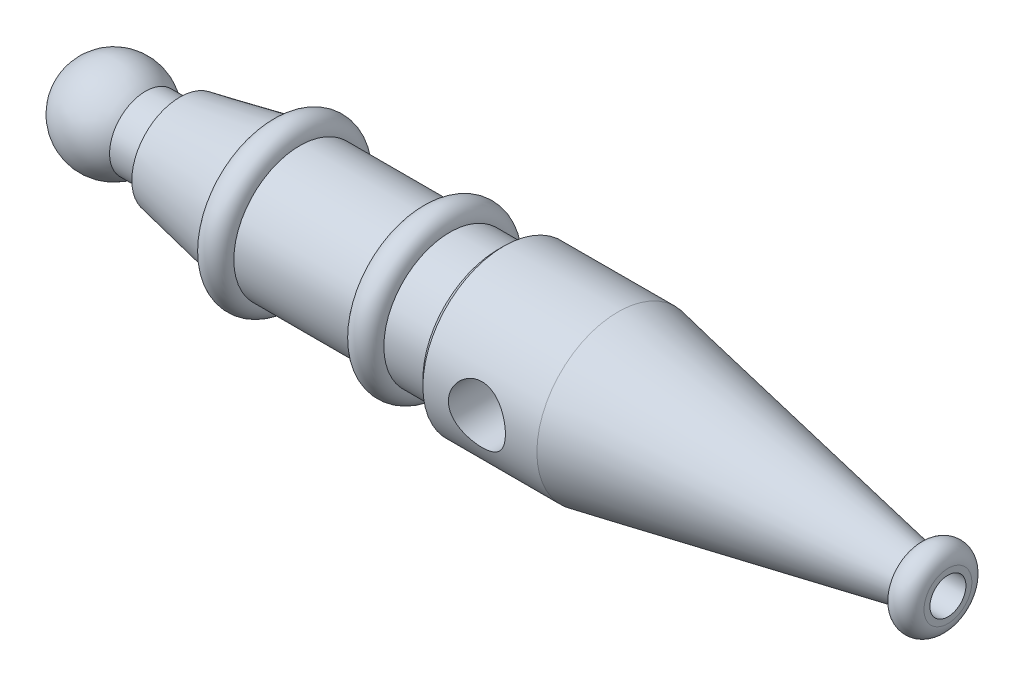
ISO-10303-21;
HEADER;
FILE_DESCRIPTION(('STEP AP214'),'2;1');
FILE_NAME('part.step','',(''),(''),'','','');
FILE_SCHEMA(('AUTOMOTIVE_DESIGN { 1 0 10303 214 1 1 1 1 }'));
ENDSEC;
DATA;
#1=APPLICATION_CONTEXT('core data for automotive mechanical design processes');
#2=APPLICATION_PROTOCOL_DEFINITION('international standard','automotive_design',2000,#1);
#3=PRODUCT_CONTEXT('',#1,'mechanical');
#4=PRODUCT('Part','Part','',(#3));
#5=PRODUCT_RELATED_PRODUCT_CATEGORY('part','',(#4));
#6=PRODUCT_DEFINITION_FORMATION('','',#4);
#7=PRODUCT_DEFINITION_CONTEXT('part definition',#1,'design');
#8=PRODUCT_DEFINITION('design','',#6,#7);
#9=PRODUCT_DEFINITION_SHAPE('','',#8);
#10=(LENGTH_UNIT() NAMED_UNIT(*) SI_UNIT(.MILLI.,.METRE.));
#11=(NAMED_UNIT(*) PLANE_ANGLE_UNIT() SI_UNIT($,.RADIAN.));
#12=(NAMED_UNIT(*) SI_UNIT($,.STERADIAN.) SOLID_ANGLE_UNIT());
#13=UNCERTAINTY_MEASURE_WITH_UNIT(LENGTH_MEASURE(1.E-05),#10,'distance_accuracy_value','');
#14=(GEOMETRIC_REPRESENTATION_CONTEXT(3) GLOBAL_UNCERTAINTY_ASSIGNED_CONTEXT((#13)) GLOBAL_UNIT_ASSIGNED_CONTEXT((#10,
#11,#12)) REPRESENTATION_CONTEXT('',''));
#15=CARTESIAN_POINT('',(0.,0.,0.));
#16=DIRECTION('',(0.,0.,1.));
#17=DIRECTION('',(1.,0.,0.));
#18=AXIS2_PLACEMENT_3D('',#15,#16,#17);
#19=CARTESIAN_POINT('',(-83.855737704918,0.,0.));
#20=DIRECTION('',(-1.,0.,0.));
#21=DIRECTION('',(0.,1.,0.));
#22=AXIS2_PLACEMENT_3D('',#19,#20,#21);
#23=SPHERICAL_SURFACE('',#22,8.);
#24=CARTESIAN_POINT('',(-78.5642350827889,0.,0.));
#25=DIRECTION('',(-1.,0.,0.));
#26=DIRECTION('',(0.,0.,1.));
#27=AXIS2_PLACEMENT_3D('',#24,#25,#26);
#28=CIRCLE('',#27,6.);
#29=CARTESIAN_POINT('',(-78.5642350827889,0.,6.));
#30=VERTEX_POINT('',#29);
#31=EDGE_CURVE('E174',#30,#30,#28,.T.);
#32=ORIENTED_EDGE('',*,*,#31,.T.);
#33=EDGE_LOOP('',(#32));
#34=FACE_BOUND('',#33,.T.);
#35=ADVANCED_FACE('F34',(#34),#23,.T.);
#36=CARTESIAN_POINT('',(5.14426229508198,2.99999999999999,0.));
#37=DIRECTION('',(-1.,0.,0.));
#38=DIRECTION('',(0.,0.,1.));
#39=AXIS2_PLACEMENT_3D('',#36,#37,#38);
#40=PLANE('',#39);
#41=CARTESIAN_POINT('',(5.14426229508191,0.,0.));
#42=DIRECTION('',(-1.,0.,0.));
#43=DIRECTION('',(0.,0.,1.));
#44=AXIS2_PLACEMENT_3D('',#41,#42,#43);
#45=CIRCLE('',#44,2.99999999999999);
#46=CARTESIAN_POINT('',(5.14426229508191,0.,2.99999999999999));
#47=VERTEX_POINT('',#46);
#48=EDGE_CURVE('E53',#47,#47,#45,.T.);
#49=ORIENTED_EDGE('',*,*,#48,.F.);
#50=EDGE_LOOP('',(#49));
#51=FACE_BOUND('',#50,.T.);
#52=ADVANCED_FACE('F108',(#51),#40,.F.);
#53=CARTESIAN_POINT('',(-1091.85573770492,0.,0.));
#54=DIRECTION('',(-1.,0.,0.));
#55=DIRECTION('',(0.,0.,1.));
#56=AXIS2_PLACEMENT_3D('',#53,#54,#55);
#57=CYLINDRICAL_SURFACE('',#56,3.);
#58=CARTESIAN_POINT('',(55.144262295082,0.,0.));
#59=DIRECTION('',(-1.,0.,0.));
#60=DIRECTION('',(0.,0.,1.));
#61=AXIS2_PLACEMENT_3D('',#58,#59,#60);
#62=CIRCLE('',#61,3.);
#63=CARTESIAN_POINT('',(55.144262295082,0.,3.));
#64=VERTEX_POINT('',#63);
#65=EDGE_CURVE('E142',#64,#64,#62,.T.);
#66=ORIENTED_EDGE('',*,*,#65,.F.);
#67=EDGE_LOOP('',(#66));
#68=FACE_BOUND('',#67,.T.);
#69=ORIENTED_EDGE('',*,*,#48,.T.);
#70=EDGE_LOOP('',(#69));
#71=FACE_BOUND('',#70,.T.);
#72=ADVANCED_FACE('F113',(#68,#71),#57,.F.);
#73=CARTESIAN_POINT('',(55.144262295082,3.,0.));
#74=DIRECTION('',(-1.,0.,0.));
#75=DIRECTION('',(0.,0.,1.));
#76=AXIS2_PLACEMENT_3D('',#73,#74,#75);
#77=PLANE('',#76);
#78=CARTESIAN_POINT('',(55.144262295082,0.,0.));
#79=DIRECTION('',(-1.,0.,0.));
#80=DIRECTION('',(0.,0.,1.));
#81=AXIS2_PLACEMENT_3D('',#78,#79,#80);
#82=CIRCLE('',#81,3.98520950843493);
#83=CARTESIAN_POINT('',(55.144262295082,0.,3.98520950843493));
#84=VERTEX_POINT('',#83);
#85=EDGE_CURVE('E139',#84,#84,#82,.T.);
#86=ORIENTED_EDGE('',*,*,#85,.F.);
#87=EDGE_LOOP('',(#86));
#88=FACE_BOUND('',#87,.T.);
#89=ORIENTED_EDGE('',*,*,#65,.T.);
#90=EDGE_LOOP('',(#89));
#91=FACE_BOUND('',#90,.T.);
#92=ADVANCED_FACE('F120',(#88,#91),#77,.F.);
#93=CARTESIAN_POINT('',(52.644262295082,0.,0.));
#94=DIRECTION('',(-1.,0.,0.));
#95=DIRECTION('',(0.,0.,1.));
#96=AXIS2_PLACEMENT_3D('',#93,#94,#95);
#97=TOROIDAL_SURFACE('',#96,3.98520950843493,2.5);
#98=CARTESIAN_POINT('',(50.1442622950821,0.,0.));
#99=DIRECTION('',(-1.,0.,0.));
#100=DIRECTION('',(0.,0.,1.));
#101=AXIS2_PLACEMENT_3D('',#98,#99,#100);
#102=CIRCLE('',#101,3.98520950843492);
#103=CARTESIAN_POINT('',(50.1442622950821,0.,3.98520950843492));
#104=VERTEX_POINT('',#103);
#105=EDGE_CURVE('E138',#104,#104,#102,.T.);
#106=ORIENTED_EDGE('',*,*,#105,.F.);
#107=EDGE_LOOP('',(#106));
#108=FACE_BOUND('',#107,.T.);
#109=ORIENTED_EDGE('',*,*,#85,.T.);
#110=EDGE_LOOP('',(#109));
#111=FACE_BOUND('',#110,.T.);
#112=ADVANCED_FACE('F124',(#108,#111),#97,.T.);
#113=CARTESIAN_POINT('',(50.1442622950821,0.,0.));
#114=DIRECTION('',(-1.,0.,0.));
#115=DIRECTION('',(0.,0.,1.));
#116=AXIS2_PLACEMENT_3D('',#113,#114,#115);
#117=CONICAL_SURFACE('',#116,3.98520950843492,0.18804743418636);
#118=CARTESIAN_POINT('',(0.14426229508202,0.,0.));
#119=DIRECTION('',(-1.,0.,0.));
#120=DIRECTION('',(0.,0.,1.));
#121=AXIS2_PLACEMENT_3D('',#118,#119,#120);
#122=CIRCLE('',#121,13.5);
#123=CARTESIAN_POINT('',(0.14426229508202,0.,13.5));
#124=VERTEX_POINT('',#123);
#125=EDGE_CURVE('E135',#124,#124,#122,.T.);
#126=CARTESIAN_POINT('',(0.14426229508202,0.,13.5));
#127=CARTESIAN_POINT('',(0.665095628415354,0.,13.4008875990462));
#128=CARTESIAN_POINT('',(1.18592896174869,0.,13.3017751980924));
#129=CARTESIAN_POINT('',(2.22759562841536,0.,13.1035503961848));
#130=CARTESIAN_POINT('',(2.74842896174869,0.,13.004437995231));
#131=CARTESIAN_POINT('',(3.79009562841536,0.,12.8062131933234));
#132=CARTESIAN_POINT('',(4.31092896174869,0.,12.7071007923696));
#133=CARTESIAN_POINT('',(5.35259562841536,0.,12.508875990462));
#134=CARTESIAN_POINT('',(5.87342896174869,0.,12.4097635895082));
#135=CARTESIAN_POINT('',(6.91509562841536,0.,12.2115387876006));
#136=CARTESIAN_POINT('',(7.43592896174869,0.,12.1124263866468));
#137=CARTESIAN_POINT('',(8.47759562841536,0.,11.9142015847392));
#138=CARTESIAN_POINT('',(8.9984289617487,0.,11.8150891837854));
#139=CARTESIAN_POINT('',(10.0400956284154,0.,11.6168643818777));
#140=CARTESIAN_POINT('',(10.5609289617487,0.,11.5177519809239));
#141=CARTESIAN_POINT('',(11.6025956284154,0.,11.3195271790163));
#142=CARTESIAN_POINT('',(12.1234289617487,0.,11.2204147780625));
#143=CARTESIAN_POINT('',(13.1650956284154,0.,11.0221899761549));
#144=CARTESIAN_POINT('',(13.6859289617487,0.,10.9230775752011));
#145=CARTESIAN_POINT('',(14.7275956284154,0.,10.7248527732935));
#146=CARTESIAN_POINT('',(15.2484289617487,0.,10.6257403723397));
#147=CARTESIAN_POINT('',(16.2900956284154,0.,10.4275155704321));
#148=CARTESIAN_POINT('',(16.8109289617487,0.,10.3284031694783));
#149=CARTESIAN_POINT('',(17.8525956284154,0.,10.1301783675707));
#150=CARTESIAN_POINT('',(18.3734289617487,0.,10.0310659666169));
#151=CARTESIAN_POINT('',(19.4150956284154,0.,9.8328411647093));
#152=CARTESIAN_POINT('',(19.9359289617487,0.,9.73372876375549));
#153=CARTESIAN_POINT('',(20.9775956284154,0.,9.53550396184789));
#154=CARTESIAN_POINT('',(21.4984289617487,0.,9.43639156089408));
#155=CARTESIAN_POINT('',(22.5400956284154,0.,9.23816675898648));
#156=CARTESIAN_POINT('',(23.0609289617487,0.,9.13905435803268));
#157=CARTESIAN_POINT('',(24.1025956284154,0.,8.94082955612507));
#158=CARTESIAN_POINT('',(24.6234289617487,0.,8.84171715517127));
#159=CARTESIAN_POINT('',(25.6650956284154,0.,8.64349235326366));
#160=CARTESIAN_POINT('',(26.1859289617487,0.,8.54437995230986));
#161=CARTESIAN_POINT('',(27.2275956284154,0.,8.34615515040225));
#162=CARTESIAN_POINT('',(27.7484289617487,0.,8.24704274944845));
#163=CARTESIAN_POINT('',(28.7900956284154,0.,8.04881794754084));
#164=CARTESIAN_POINT('',(29.3109289617487,0.,7.94970554658704));
#165=CARTESIAN_POINT('',(30.3525956284154,0.,7.75148074467943));
#166=CARTESIAN_POINT('',(30.8734289617487,0.,7.65236834372563));
#167=CARTESIAN_POINT('',(31.9150956284154,0.,7.45414354181802));
#168=CARTESIAN_POINT('',(32.4359289617487,0.,7.35503114086422));
#169=CARTESIAN_POINT('',(33.4775956284154,0.,7.15680633895662));
#170=CARTESIAN_POINT('',(33.9984289617487,0.,7.05769393800281));
#171=CARTESIAN_POINT('',(35.0400956284154,0.,6.85946913609521));
#172=CARTESIAN_POINT('',(35.5609289617487,0.,6.7603567351414));
#173=CARTESIAN_POINT('',(36.6025956284154,0.,6.5621319332338));
#174=CARTESIAN_POINT('',(37.1234289617487,0.,6.46301953227999));
#175=CARTESIAN_POINT('',(38.1650956284154,0.,6.26479473037239));
#176=CARTESIAN_POINT('',(38.6859289617487,0.,6.16568232941859));
#177=CARTESIAN_POINT('',(39.7275956284154,0.,5.96745752751098));
#178=CARTESIAN_POINT('',(40.2484289617487,0.,5.86834512655718));
#179=CARTESIAN_POINT('',(41.2900956284154,0.,5.67012032464957));
#180=CARTESIAN_POINT('',(41.8109289617487,0.,5.57100792369577));
#181=CARTESIAN_POINT('',(42.8525956284154,0.,5.37278312178816));
#182=CARTESIAN_POINT('',(43.3734289617487,0.,5.27367072083436));
#183=CARTESIAN_POINT('',(44.4150956284154,0.,5.07544591892675));
#184=CARTESIAN_POINT('',(44.9359289617487,0.,4.97633351797295));
#185=CARTESIAN_POINT('',(45.9775956284154,0.,4.77810871606534));
#186=CARTESIAN_POINT('',(46.4984289617487,0.,4.67899631511154));
#187=CARTESIAN_POINT('',(47.5400956284154,0.,4.48077151320394));
#188=CARTESIAN_POINT('',(48.0609289617487,0.,4.38165911225013));
#189=CARTESIAN_POINT('',(49.1025956284154,0.,4.18343431034253));
#190=CARTESIAN_POINT('',(49.6234289617487,0.,4.08432190938872));
#191=CARTESIAN_POINT('',(50.1442622950821,0.,3.98520950843492));
#192=B_SPLINE_CURVE_WITH_KNOTS('',3,(#126,#127,#128,#129,#130,#131,#132,#133,#134,#135,#136,
#137,#138,#139,#140,#141,#142,#143,#144,#145,#146,#147,#148,#149,#150,#151,#152,#153,#154,#155,
#156,#157,#158,#159,#160,#161,#162,#163,#164,#165,#166,#167,#168,#169,#170,#171,#172,#173,#174,
#175,#176,#177,#178,#179,#180,#181,#182,#183,#184,#185,#186,#187,#188,#189,#190,#191),
.UNSPECIFIED.,.F.,.F.,(4,2,2,2,2,2,2,2,2,2,2,2,2,2,2,2,2,2,2,2,2,2,2,2,2,2,2,2,2,2,2,2,4),(0.,
1.5905394249139,3.18107884982781,4.77161827474171,6.36215769965561,7.95269712456952,
9.54323654948342,11.1337759743973,12.7243153993112,14.3148548242251,15.905394249139,
17.4959336740529,19.0864730989668,20.6770125238807,22.2675519487947,23.8580913737086,
25.4486307986225,27.0391702235364,28.6297096484503,30.2202490733642,31.8107884982781,
33.401327923192,34.9918673481059,36.5824067730198,38.1729461979337,39.7634856228476,
41.3540250477615,42.9445644726754,44.5351038975893,46.1256433225032,47.7161827474171,
49.306722172331,50.8972615972449),.UNSPECIFIED.);
#193=EDGE_CURVE('BSEAM104',#124,#104,#192,.T.);
#194=ORIENTED_EDGE('',*,*,#125,.F.);
#195=ORIENTED_EDGE('',*,*,#105,.T.);
#196=ORIENTED_EDGE('',*,*,#193,.T.);
#197=ORIENTED_EDGE('',*,*,#193,.F.);
#198=EDGE_LOOP('',(#194,#196,#195,#197));
#199=FACE_BOUND('',#198,.T.);
#200=ADVANCED_FACE('F104',(#199),#117,.T.);
#201=CARTESIAN_POINT('',(-1091.85573770492,0.,0.));
#202=DIRECTION('',(-1.,0.,0.));
#203=DIRECTION('',(0.,0.,1.));
#204=AXIS2_PLACEMENT_3D('',#201,#202,#203);
#205=CYLINDRICAL_SURFACE('',#204,13.5);
#206=CARTESIAN_POINT('',(-5.10573770491799,0.,13.5));
#207=CARTESIAN_POINT('',(-5.10573744036889,-0.129143118267124,13.5000001881197));
#208=CARTESIAN_POINT('',(-5.11100857769051,-0.258282263427184,13.4981427554375));
#209=CARTESIAN_POINT('',(-5.13204354712407,-0.515643118743995,13.4907631042694));
#210=CARTESIAN_POINT('',(-5.14781098929143,-0.643864497906921,13.4852396249006));
#211=CARTESIAN_POINT('',(-5.18968056866981,-0.898350385882534,13.4706794516002));
#212=CARTESIAN_POINT('',(-5.21577854862057,-1.02461566066553,13.4616441709295));
#213=CARTESIAN_POINT('',(-5.27807480111822,-1.27439359592537,13.4402991871952));
#214=CARTESIAN_POINT('',(-5.31427698568176,-1.39790517021871,13.4279882159781));
#215=CARTESIAN_POINT('',(-5.39637096186523,-1.64102640212671,13.4004462333366));
#216=CARTESIAN_POINT('',(-5.44224118298111,-1.76064407280258,13.3852217291859));
#217=CARTESIAN_POINT('',(-5.54333615813542,-1.99551126369133,13.3522294790378));
#218=CARTESIAN_POINT('',(-5.59856438878123,-2.11075914093149,13.3344607882277));
#219=CARTESIAN_POINT('',(-5.77766180475297,-2.44881866958133,13.2780007756231));
#220=CARTESIAN_POINT('',(-5.91501101057603,-2.66414418304814,13.2361319891791));
#221=CARTESIAN_POINT('',(-6.22702149502384,-3.07637989982878,13.146560140978));
#222=CARTESIAN_POINT('',(-6.40280146348474,-3.27240456353071,13.0987061712714));
#223=CARTESIAN_POINT('',(-6.78436847876588,-3.63291499144245,13.0033351638072));
#224=CARTESIAN_POINT('',(-6.99016316226134,-3.79739270439892,12.9558182150343));
#225=CARTESIAN_POINT('',(-7.43412315633841,-4.09537008056647,12.8648000151555));
#226=CARTESIAN_POINT('',(-7.67312672463632,-4.22768134522449,12.8214808085843));
#227=CARTESIAN_POINT('',(-8.1717637950013,-4.4498483340765,12.7460861209466));
#228=CARTESIAN_POINT('',(-8.4313901367749,-4.53971871926191,12.7140067581216));
#229=CARTESIAN_POINT('',(-8.95382018101994,-4.67106811935983,12.6663283225888));
#230=CARTESIAN_POINT('',(-9.21615198779374,-4.71421253943546,12.6501640862265));
#231=CARTESIAN_POINT('',(-9.74479134751373,-4.756093772565,12.6344814189514));
#232=CARTESIAN_POINT('',(-10.0110974679392,-4.75484621766067,12.6349571285027));
#233=CARTESIAN_POINT('',(-10.5254938014516,-4.70926313153212,12.6520087666769));
#234=CARTESIAN_POINT('',(-10.7738141814143,-4.66715760222383,12.6677514090504));
#235=CARTESIAN_POINT('',(-11.259609899418,-4.54471269507593,12.7121903878487));
#236=CARTESIAN_POINT('',(-11.4970837937993,-4.46436824382044,12.7408884431295));
#237=CARTESIAN_POINT('',(-11.9592849092232,-4.26637020092715,12.8085578761397));
#238=CARTESIAN_POINT('',(-12.1837185695898,-4.14809196731063,12.8476992640918));
#239=CARTESIAN_POINT('',(-12.6102326267118,-3.87801791894732,12.9317801734432));
#240=CARTESIAN_POINT('',(-12.8123059659028,-3.72621156679362,12.9767215158351));
#241=CARTESIAN_POINT('',(-13.2008165217959,-3.38289946693516,13.0705554134897));
#242=CARTESIAN_POINT('',(-13.3856435426399,-3.18958862751562,13.1195251828097));
#243=CARTESIAN_POINT('',(-13.7207019965691,-2.77412630285129,13.2136118163539));
#244=CARTESIAN_POINT('',(-13.8709293096312,-2.55197138786578,13.2587282213297));
#245=CARTESIAN_POINT('',(-14.1340215738417,-2.08141552473883,13.3407404209996));
#246=CARTESIAN_POINT('',(-14.2464101634896,-1.83272836450297,13.3775296224074));
#247=CARTESIAN_POINT('',(-14.4272412136978,-1.31836699811192,13.4379621339847));
#248=CARTESIAN_POINT('',(-14.495700763603,-1.05269944197857,13.4616105557207));
#249=CARTESIAN_POINT('',(-14.5837736261156,-0.525515952005381,13.492227759709));
#250=CARTESIAN_POINT('',(-14.6055593581671,-0.264405565181762,13.4999377467608));
#251=CARTESIAN_POINT('',(-14.605913769804,0.257820224165093,13.5000614504562));
#252=CARTESIAN_POINT('',(-14.5844907030439,0.51893561620478,13.4924780884034));
#253=CARTESIAN_POINT('',(-14.5007274857427,1.02476686229099,13.4633570672028));
#254=CARTESIAN_POINT('',(-14.4397592691548,1.2697395787276,13.4422875914593));
#255=CARTESIAN_POINT('',(-14.2803907886722,1.74585009719055,13.3887805744997));
#256=CARTESIAN_POINT('',(-14.1819856762328,1.97698610270077,13.3563415608295));
#257=CARTESIAN_POINT('',(-13.9475280740239,2.42604461219743,13.2822275039573));
#258=CARTESIAN_POINT('',(-13.8105045094739,2.64342072100384,13.2403206470867));
#259=CARTESIAN_POINT('',(-13.5038203595038,3.052778022945,13.1519759547699));
#260=CARTESIAN_POINT('',(-13.3341488432779,3.24475067435768,13.1055366043805));
#261=CARTESIAN_POINT('',(-12.956795208368,3.60804141394369,13.0103461311236));
#262=CARTESIAN_POINT('',(-12.7476182058356,3.77781134181072,12.9615976232278));
#263=CARTESIAN_POINT('',(-12.3027274001667,4.08008055282651,12.8696535074987));
#264=CARTESIAN_POINT('',(-12.0670125755709,4.2125784006596,12.8264581135458));
#265=CARTESIAN_POINT('',(-11.574933007955,4.43620210291474,12.7508481529211));
#266=CARTESIAN_POINT('',(-11.31856246948,4.52731629823458,12.7184366250972));
#267=CARTESIAN_POINT('',(-10.792687424393,4.66458679700227,12.6687435526386));
#268=CARTESIAN_POINT('',(-10.523189830096,4.71076649853885,12.6514541341614));
#269=CARTESIAN_POINT('',(-9.99525522626536,4.75491034673005,12.6349249369861));
#270=CARTESIAN_POINT('',(-9.73706386708964,4.75547384708907,12.6347120885142));
#271=CARTESIAN_POINT('',(-9.22447489334188,4.71487963226396,12.6499157509016));
#272=CARTESIAN_POINT('',(-8.97007700188881,4.67372497731676,12.6653311153527));
#273=CARTESIAN_POINT('',(-8.4783341822418,4.55278977905758,12.7092906851952));
#274=CARTESIAN_POINT('',(-8.24072840893677,4.47394440926196,12.7375162315793));
#275=CARTESIAN_POINT('',(-7.78194559520495,4.28063977274348,12.8037690885736));
#276=CARTESIAN_POINT('',(-7.56077245923827,4.16617207532328,12.8417987191398));
#277=CARTESIAN_POINT('',(-7.12973062255194,3.89856473505753,12.9256237375628));
#278=CARTESIAN_POINT('',(-6.92090147385217,3.74384337587838,12.9717026524415));
#279=CARTESIAN_POINT('',(-6.53125871699683,3.4025524256821,13.0653675931415));
#280=CARTESIAN_POINT('',(-6.35045348486726,3.21597334764451,13.1129540644552));
#281=CARTESIAN_POINT('',(-6.09993946800656,2.91116692075967,13.1828182162676));
#282=CARTESIAN_POINT('',(-6.01836304318312,2.80276460208756,13.2063451645229));
#283=CARTESIAN_POINT('',(-5.86465107852781,2.57916756755795,13.2518257121555));
#284=CARTESIAN_POINT('',(-5.79251202221653,2.4639754050208,13.2737798961766));
#285=CARTESIAN_POINT('',(-5.65820530197404,2.22749300667711,13.3155059940571));
#286=CARTESIAN_POINT('',(-5.59604103555102,2.1062007115054,13.3352771636489));
#287=CARTESIAN_POINT('',(-5.48225642262551,1.85842265798346,13.3720581872594));
#288=CARTESIAN_POINT('',(-5.43063145151616,1.73193920688356,13.3890692517274));
#289=CARTESIAN_POINT('',(-5.33866976116436,1.47547742008163,13.4197442115705));
#290=CARTESIAN_POINT('',(-5.29826174131208,1.34552719740973,13.4334291766632));
#291=CARTESIAN_POINT('',(-5.22870127923054,1.0823797562171,13.4571875479529));
#292=CARTESIAN_POINT('',(-5.1995441063522,0.949183927478689,13.467262471938));
#293=CARTESIAN_POINT('',(-5.15276762805417,0.680556940884977,13.4835064357787));
#294=CARTESIAN_POINT('',(-5.1351472623988,0.545125989611111,13.4896758345514));
#295=CARTESIAN_POINT('',(-5.11163271777666,0.273128508675537,13.4979224205058));
#296=CARTESIAN_POINT('',(-5.1057379846647,0.136562032984239,13.4999998010733));
#297=CARTESIAN_POINT('',(-5.10573770491799,0.,13.5));
#298=B_SPLINE_CURVE_WITH_KNOTS('',3,(#206,#207,#208,#209,#210,#211,#212,#213,#214,#215,#216,
#217,#218,#219,#220,#221,#222,#223,#224,#225,#226,#227,#228,#229,#230,#231,#232,#233,#234,#235,
#236,#237,#238,#239,#240,#241,#242,#243,#244,#245,#246,#247,#248,#249,#250,#251,#252,#253,#254,
#255,#256,#257,#258,#259,#260,#261,#262,#263,#264,#265,#266,#267,#268,#269,#270,#271,#272,#273,
#274,#275,#276,#277,#278,#279,#280,#281,#282,#283,#284,#285,#286,#287,#288,#289,#290,#291,#292,
#293,#294,#295,#296,#297),.UNSPECIFIED.,.T.,.F.,(4,2,2,2,2,2,2,2,2,2,2,2,2,2,2,2,2,2,2,2,2,2,2,
2,2,2,2,2,2,2,2,2,2,2,2,2,2,2,2,2,2,2,2,2,2,4),(0.,0.38730216989248,0.774737615751539,
1.1620173063921,1.54944714752213,1.93602156887627,2.32273992319906,3.09555293183945,
3.89488660931953,4.69442401803975,5.52009752459107,6.34548559730392,7.14037470506226,
7.93498390599718,8.68852984909684,9.44217579810582,10.2089305578419,10.9759266413905,
11.7878688381559,12.5999076684873,13.421817361481,14.2434071197046,15.0258416189784,
15.8081266734056,16.5646269901033,17.3212253163988,18.0988695181718,18.876774536148,
19.6942648243076,20.5117865890055,21.3295385331554,22.1468644329315,22.9175817299363,
23.6882424950342,24.4407027285909,25.1933411816964,25.9818130314112,26.7705200937117,
27.1831818832618,27.595689469329,28.0083372625073,28.4208035962026,28.8305846978508,
29.2401933103988,29.6497642745192,30.059315882142),.UNSPECIFIED.);
#299=CARTESIAN_POINT('',(-5.10573770491799,0.,13.5));
#300=VERTEX_POINT('',#299);
#301=EDGE_CURVE('E39',#300,#300,#298,.T.);
#302=ORIENTED_EDGE('',*,*,#301,.T.);
#303=EDGE_LOOP('',(#302));
#304=FACE_BOUND('',#303,.T.);
#305=CARTESIAN_POINT('',(-5.105737704918,0.,-13.5));
#306=CARTESIAN_POINT('',(-5.1057374403689,0.129143118267124,-13.5000001881197));
#307=CARTESIAN_POINT('',(-5.11100857769051,0.258282263427184,-13.4981427554375));
#308=CARTESIAN_POINT('',(-5.13204354712407,0.515643118743996,-13.4907631042694));
#309=CARTESIAN_POINT('',(-5.14781098929143,0.643864497906923,-13.4852396249006));
#310=CARTESIAN_POINT('',(-5.18968056866981,0.898350385882535,-13.4706794516002));
#311=CARTESIAN_POINT('',(-5.21577854862057,1.02461566066553,-13.4616441709295));
#312=CARTESIAN_POINT('',(-5.27807480111822,1.27439359592537,-13.4402991871952));
#313=CARTESIAN_POINT('',(-5.31427698568176,1.39790517021871,-13.4279882159781));
#314=CARTESIAN_POINT('',(-5.39637096186523,1.64102640212671,-13.4004462333366));
#315=CARTESIAN_POINT('',(-5.44224118298111,1.76064407280258,-13.3852217291859));
#316=CARTESIAN_POINT('',(-5.54333615813542,1.99551126369133,-13.3522294790378));
#317=CARTESIAN_POINT('',(-5.59856438878123,2.11075914093149,-13.3344607882277));
#318=CARTESIAN_POINT('',(-5.77766180475297,2.44881866958133,-13.2780007756231));
#319=CARTESIAN_POINT('',(-5.91501101057603,2.66414418304814,-13.2361319891791));
#320=CARTESIAN_POINT('',(-6.22702149502385,3.07637989982878,-13.146560140978));
#321=CARTESIAN_POINT('',(-6.40280146348474,3.27240456353071,-13.0987061712714));
#322=CARTESIAN_POINT('',(-6.78436847876588,3.63291499144245,-13.0033351638072));
#323=CARTESIAN_POINT('',(-6.99016316226134,3.79739270439892,-12.9558182150343));
#324=CARTESIAN_POINT('',(-7.43412315633841,4.09537008056647,-12.8648000151555));
#325=CARTESIAN_POINT('',(-7.67312672463632,4.22768134522449,-12.8214808085843));
#326=CARTESIAN_POINT('',(-8.1717637950013,4.4498483340765,-12.7460861209466));
#327=CARTESIAN_POINT('',(-8.4313901367749,4.53971871926191,-12.7140067581216));
#328=CARTESIAN_POINT('',(-8.95382018101994,4.67106811935983,-12.6663283225888));
#329=CARTESIAN_POINT('',(-9.21615198779374,4.71421253943546,-12.6501640862265));
#330=CARTESIAN_POINT('',(-9.74479134751373,4.756093772565,-12.6344814189514));
#331=CARTESIAN_POINT('',(-10.0110974679392,4.75484621766067,-12.6349571285027));
#332=CARTESIAN_POINT('',(-10.5254938014516,4.70926313153212,-12.6520087666769));
#333=CARTESIAN_POINT('',(-10.7738141814143,4.66715760222383,-12.6677514090504));
#334=CARTESIAN_POINT('',(-11.259609899418,4.54471269507593,-12.7121903878487));
#335=CARTESIAN_POINT('',(-11.4970837937993,4.46436824382044,-12.7408884431295));
#336=CARTESIAN_POINT('',(-11.9592849092232,4.26637020092715,-12.8085578761397));
#337=CARTESIAN_POINT('',(-12.1837185695898,4.14809196731063,-12.8476992640918));
#338=CARTESIAN_POINT('',(-12.6102326267118,3.87801791894732,-12.9317801734432));
#339=CARTESIAN_POINT('',(-12.8123059659028,3.72621156679362,-12.9767215158351));
#340=CARTESIAN_POINT('',(-13.2008165217959,3.38289946693516,-13.0705554134897));
#341=CARTESIAN_POINT('',(-13.3856435426399,3.18958862751562,-13.1195251828097));
#342=CARTESIAN_POINT('',(-13.7207019965691,2.77412630285128,-13.2136118163539));
#343=CARTESIAN_POINT('',(-13.8709293096312,2.55197138786578,-13.2587282213297));
#344=CARTESIAN_POINT('',(-14.1340215738417,2.08141552473883,-13.3407404209996));
#345=CARTESIAN_POINT('',(-14.2464101634896,1.83272836450297,-13.3775296224074));
#346=CARTESIAN_POINT('',(-14.4272412136978,1.31836699811192,-13.4379621339847));
#347=CARTESIAN_POINT('',(-14.495700763603,1.05269944197857,-13.4616105557207));
#348=CARTESIAN_POINT('',(-14.5837736261156,0.52551595200538,-13.492227759709));
#349=CARTESIAN_POINT('',(-14.6055593581671,0.26440556518176,-13.4999377467608));
#350=CARTESIAN_POINT('',(-14.605913769804,-0.257820224165094,-13.5000614504562));
#351=CARTESIAN_POINT('',(-14.5844907030439,-0.518935616204781,-13.4924780884034));
#352=CARTESIAN_POINT('',(-14.5007274857427,-1.02476686229099,-13.4633570672028));
#353=CARTESIAN_POINT('',(-14.4397592691548,-1.2697395787276,-13.4422875914593));
#354=CARTESIAN_POINT('',(-14.2803907886722,-1.74585009719055,-13.3887805744997));
#355=CARTESIAN_POINT('',(-14.1819856762328,-1.97698610270077,-13.3563415608295));
#356=CARTESIAN_POINT('',(-13.9475280740239,-2.42604461219744,-13.2822275039573));
#357=CARTESIAN_POINT('',(-13.8105045094739,-2.64342072100384,-13.2403206470867));
#358=CARTESIAN_POINT('',(-13.5038203595037,-3.052778022945,-13.1519759547699));
#359=CARTESIAN_POINT('',(-13.3341488432779,-3.24475067435768,-13.1055366043805));
#360=CARTESIAN_POINT('',(-12.956795208368,-3.60804141394369,-13.0103461311236));
#361=CARTESIAN_POINT('',(-12.7476182058356,-3.77781134181072,-12.9615976232278));
#362=CARTESIAN_POINT('',(-12.3027274001667,-4.08008055282651,-12.8696535074987));
#363=CARTESIAN_POINT('',(-12.0670125755709,-4.2125784006596,-12.8264581135458));
#364=CARTESIAN_POINT('',(-11.574933007955,-4.43620210291474,-12.7508481529211));
#365=CARTESIAN_POINT('',(-11.31856246948,-4.52731629823458,-12.7184366250972));
#366=CARTESIAN_POINT('',(-10.792687424393,-4.66458679700227,-12.6687435526386));
#367=CARTESIAN_POINT('',(-10.523189830096,-4.71076649853885,-12.6514541341614));
#368=CARTESIAN_POINT('',(-9.99525522626536,-4.75491034673005,-12.6349249369861));
#369=CARTESIAN_POINT('',(-9.73706386708964,-4.75547384708907,-12.6347120885142));
#370=CARTESIAN_POINT('',(-9.22447489334188,-4.71487963226396,-12.6499157509016));
#371=CARTESIAN_POINT('',(-8.97007700188881,-4.67372497731676,-12.6653311153527));
#372=CARTESIAN_POINT('',(-8.4783341822418,-4.55278977905758,-12.7092906851952));
#373=CARTESIAN_POINT('',(-8.24072840893677,-4.47394440926196,-12.7375162315793));
#374=CARTESIAN_POINT('',(-7.78194559520495,-4.28063977274348,-12.8037690885736));
#375=CARTESIAN_POINT('',(-7.56077245923827,-4.16617207532328,-12.8417987191398));
#376=CARTESIAN_POINT('',(-7.12973062255194,-3.89856473505752,-12.9256237375628));
#377=CARTESIAN_POINT('',(-6.92090147385217,-3.74384337587837,-12.9717026524415));
#378=CARTESIAN_POINT('',(-6.53125871699682,-3.4025524256821,-13.0653675931415));
#379=CARTESIAN_POINT('',(-6.35045348486725,-3.21597334764451,-13.1129540644552));
#380=CARTESIAN_POINT('',(-6.09993946800656,-2.91116692075967,-13.1828182162676));
#381=CARTESIAN_POINT('',(-6.01836304318312,-2.80276460208756,-13.2063451645229));
#382=CARTESIAN_POINT('',(-5.86465107852781,-2.57916756755794,-13.2518257121555));
#383=CARTESIAN_POINT('',(-5.79251202221653,-2.46397540502079,-13.2737798961766));
#384=CARTESIAN_POINT('',(-5.65820530197404,-2.2274930066771,-13.3155059940571));
#385=CARTESIAN_POINT('',(-5.59604103555102,-2.10620071150539,-13.3352771636489));
#386=CARTESIAN_POINT('',(-5.48225642262551,-1.85842265798346,-13.3720581872594));
#387=CARTESIAN_POINT('',(-5.43063145151616,-1.73193920688356,-13.3890692517274));
#388=CARTESIAN_POINT('',(-5.33866976116436,-1.47547742008162,-13.4197442115705));
#389=CARTESIAN_POINT('',(-5.29826174131207,-1.34552719740973,-13.4334291766632));
#390=CARTESIAN_POINT('',(-5.22870127923054,-1.0823797562171,-13.4571875479529));
#391=CARTESIAN_POINT('',(-5.1995441063522,-0.949183927478687,-13.467262471938));
#392=CARTESIAN_POINT('',(-5.15276762805417,-0.680556940884976,-13.4835064357787));
#393=CARTESIAN_POINT('',(-5.13514726239879,-0.54512598961111,-13.4896758345514));
#394=CARTESIAN_POINT('',(-5.11163271777666,-0.273128508675537,-13.4979224205058));
#395=CARTESIAN_POINT('',(-5.1057379846647,-0.136562032984239,-13.4999998010733));
#396=CARTESIAN_POINT('',(-5.105737704918,0.,-13.5));
#397=B_SPLINE_CURVE_WITH_KNOTS('',3,(#305,#306,#307,#308,#309,#310,#311,#312,#313,#314,#315,
#316,#317,#318,#319,#320,#321,#322,#323,#324,#325,#326,#327,#328,#329,#330,#331,#332,#333,#334,
#335,#336,#337,#338,#339,#340,#341,#342,#343,#344,#345,#346,#347,#348,#349,#350,#351,#352,#353,
#354,#355,#356,#357,#358,#359,#360,#361,#362,#363,#364,#365,#366,#367,#368,#369,#370,#371,#372,
#373,#374,#375,#376,#377,#378,#379,#380,#381,#382,#383,#384,#385,#386,#387,#388,#389,#390,#391,
#392,#393,#394,#395,#396),.UNSPECIFIED.,.T.,.F.,(4,2,2,2,2,2,2,2,2,2,2,2,2,2,2,2,2,2,2,2,2,2,2,
2,2,2,2,2,2,2,2,2,2,2,2,2,2,2,2,2,2,2,2,2,2,4),(0.,0.387302169892482,0.77473761575154,
1.16201730639211,1.54944714752213,1.93602156887627,2.32273992319906,3.09555293183945,
3.89488660931953,4.69442401803975,5.52009752459107,6.34548559730392,7.14037470506226,
7.93498390599718,8.68852984909684,9.44217579810582,10.2089305578419,10.9759266413905,
11.7878688381559,12.5999076684873,13.421817361481,14.2434071197046,15.0258416189784,
15.8081266734056,16.5646269901033,17.3212253163988,18.0988695181718,18.8767745361481,
19.6942648243076,20.5117865890055,21.3295385331554,22.1468644329315,22.9175817299363,
23.6882424950342,24.4407027285909,25.1933411816964,25.9818130314112,26.7705200937117,
27.1831818832618,27.595689469329,28.0083372625073,28.4208035962026,28.8305846978508,
29.2401933103988,29.6497642745192,30.059315882142),.UNSPECIFIED.);
#398=CARTESIAN_POINT('',(-5.105737704918,0.,-13.5));
#399=VERTEX_POINT('',#398);
#400=EDGE_CURVE('E56',#399,#399,#397,.T.);
#401=ORIENTED_EDGE('',*,*,#400,.T.);
#402=EDGE_LOOP('',(#401));
#403=FACE_BOUND('',#402,.T.);
#404=CARTESIAN_POINT('',(-18.8557377049181,0.,0.));
#405=DIRECTION('',(1.,0.,0.));
#406=DIRECTION('',(0.,0.,-1.));
#407=AXIS2_PLACEMENT_3D('',#404,#405,#406);
#408=CIRCLE('',#407,13.5);
#409=CARTESIAN_POINT('',(-18.8557377049181,0.,-13.5));
#410=VERTEX_POINT('',#409);
#411=EDGE_CURVE('E10',#410,#410,#408,.T.);
#412=ORIENTED_EDGE('',*,*,#411,.T.);
#413=EDGE_LOOP('',(#412));
#414=FACE_BOUND('',#413,.T.);
#415=ORIENTED_EDGE('',*,*,#125,.T.);
#416=EDGE_LOOP('',(#415));
#417=FACE_BOUND('',#416,.T.);
#418=ADVANCED_FACE('F61',(#304,#403,#414,#417),#205,.T.);
#419=CARTESIAN_POINT('',(-19.855737704918,11.,0.));
#420=DIRECTION('',(1.,0.,0.));
#421=DIRECTION('',(0.,0.,-1.));
#422=AXIS2_PLACEMENT_3D('',#419,#420,#421);
#423=PLANE('',#422);
#424=CARTESIAN_POINT('',(-19.855737704918,0.,0.));
#425=DIRECTION('',(1.,0.,0.));
#426=DIRECTION('',(0.,0.,-1.));
#427=AXIS2_PLACEMENT_3D('',#424,#425,#426);
#428=CIRCLE('',#427,12.5);
#429=CARTESIAN_POINT('',(-19.855737704918,0.,-12.5));
#430=VERTEX_POINT('',#429);
#431=EDGE_CURVE('E48',#430,#430,#428,.F.);
#432=ORIENTED_EDGE('',*,*,#431,.T.);
#433=EDGE_LOOP('',(#432));
#434=FACE_BOUND('',#433,.T.);
#435=CARTESIAN_POINT('',(-19.855737704918,0.,0.));
#436=DIRECTION('',(-1.,0.,0.));
#437=DIRECTION('',(0.,0.,1.));
#438=AXIS2_PLACEMENT_3D('',#435,#436,#437);
#439=CIRCLE('',#438,11.);
#440=CARTESIAN_POINT('',(-19.855737704918,0.,11.));
#441=VERTEX_POINT('',#440);
#442=EDGE_CURVE('E144',#441,#441,#439,.T.);
#443=ORIENTED_EDGE('',*,*,#442,.F.);
#444=EDGE_LOOP('',(#443));
#445=FACE_BOUND('',#444,.T.);
#446=ADVANCED_FACE('F97',(#434,#445),#423,.F.);
#447=CARTESIAN_POINT('',(-1091.85573770492,0.,0.));
#448=DIRECTION('',(-1.,0.,0.));
#449=DIRECTION('',(0.,0.,1.));
#450=AXIS2_PLACEMENT_3D('',#447,#448,#449);
#451=CYLINDRICAL_SURFACE('',#450,11.);
#452=CARTESIAN_POINT('',(-27.855737704918,0.,0.));
#453=DIRECTION('',(-1.,0.,0.));
#454=DIRECTION('',(0.,0.,1.));
#455=AXIS2_PLACEMENT_3D('',#452,#453,#454);
#456=CIRCLE('',#455,11.);
#457=CARTESIAN_POINT('',(-27.855737704918,0.,11.));
#458=VERTEX_POINT('',#457);
#459=EDGE_CURVE('E156',#458,#458,#456,.T.);
#460=ORIENTED_EDGE('',*,*,#459,.F.);
#461=EDGE_LOOP('',(#460));
#462=FACE_BOUND('',#461,.T.);
#463=ORIENTED_EDGE('',*,*,#442,.T.);
#464=EDGE_LOOP('',(#463));
#465=FACE_BOUND('',#464,.T.);
#466=ADVANCED_FACE('F94',(#462,#465),#451,.T.);
#467=CARTESIAN_POINT('',(-30.355737704918,0.,0.));
#468=DIRECTION('',(-1.,0.,0.));
#469=DIRECTION('',(0.,0.,1.));
#470=AXIS2_PLACEMENT_3D('',#467,#468,#469);
#471=TOROIDAL_SURFACE('',#470,11.,2.5);
#472=CARTESIAN_POINT('',(-32.8557377049181,0.,0.));
#473=DIRECTION('',(-1.,0.,0.));
#474=DIRECTION('',(0.,0.,1.));
#475=AXIS2_PLACEMENT_3D('',#472,#473,#474);
#476=CIRCLE('',#475,11.);
#477=CARTESIAN_POINT('',(-32.8557377049181,0.,11.));
#478=VERTEX_POINT('',#477);
#479=EDGE_CURVE('E159',#478,#478,#476,.T.);
#480=ORIENTED_EDGE('',*,*,#479,.F.);
#481=EDGE_LOOP('',(#480));
#482=FACE_BOUND('',#481,.T.);
#483=ORIENTED_EDGE('',*,*,#459,.T.);
#484=EDGE_LOOP('',(#483));
#485=FACE_BOUND('',#484,.T.);
#486=ADVANCED_FACE('F90',(#482,#485),#471,.T.);
#487=CARTESIAN_POINT('',(-1091.85573770492,0.,0.));
#488=DIRECTION('',(-1.,0.,0.));
#489=DIRECTION('',(0.,0.,1.));
#490=AXIS2_PLACEMENT_3D('',#487,#488,#489);
#491=CYLINDRICAL_SURFACE('',#490,11.);
#492=CARTESIAN_POINT('',(-52.8557377049181,0.,0.));
#493=DIRECTION('',(-1.,0.,0.));
#494=DIRECTION('',(0.,0.,1.));
#495=AXIS2_PLACEMENT_3D('',#492,#493,#494);
#496=CIRCLE('',#495,11.);
#497=CARTESIAN_POINT('',(-52.8557377049181,0.,11.));
#498=VERTEX_POINT('',#497);
#499=EDGE_CURVE('E162',#498,#498,#496,.T.);
#500=ORIENTED_EDGE('',*,*,#499,.F.);
#501=EDGE_LOOP('',(#500));
#502=FACE_BOUND('',#501,.T.);
#503=ORIENTED_EDGE('',*,*,#479,.T.);
#504=EDGE_LOOP('',(#503));
#505=FACE_BOUND('',#504,.T.);
#506=ADVANCED_FACE('F86',(#502,#505),#491,.T.);
#507=CARTESIAN_POINT('',(-55.355737704918,0.,0.));
#508=DIRECTION('',(-1.,0.,0.));
#509=DIRECTION('',(0.,0.,1.));
#510=AXIS2_PLACEMENT_3D('',#507,#508,#509);
#511=TOROIDAL_SURFACE('',#510,11.,2.5);
#512=CARTESIAN_POINT('',(-57.855737704918,0.,0.));
#513=DIRECTION('',(-1.,0.,0.));
#514=DIRECTION('',(0.,0.,1.));
#515=AXIS2_PLACEMENT_3D('',#512,#513,#514);
#516=CIRCLE('',#515,11.);
#517=CARTESIAN_POINT('',(-57.855737704918,0.,11.));
#518=VERTEX_POINT('',#517);
#519=EDGE_CURVE('E165',#518,#518,#516,.T.);
#520=ORIENTED_EDGE('',*,*,#519,.F.);
#521=EDGE_LOOP('',(#520));
#522=FACE_BOUND('',#521,.T.);
#523=ORIENTED_EDGE('',*,*,#499,.T.);
#524=EDGE_LOOP('',(#523));
#525=FACE_BOUND('',#524,.T.);
#526=ADVANCED_FACE('F82',(#522,#525),#511,.T.);
#527=CARTESIAN_POINT('',(-57.855737704918,0.,0.));
#528=DIRECTION('',(1.,0.,0.));
#529=DIRECTION('',(0.,0.,-1.));
#530=AXIS2_PLACEMENT_3D('',#527,#528,#529);
#531=CONICAL_SURFACE('',#530,11.,0.197395559849882);
#532=CARTESIAN_POINT('',(-72.8557377049179,0.,0.));
#533=DIRECTION('',(-1.,0.,0.));
#534=DIRECTION('',(0.,0.,1.));
#535=AXIS2_PLACEMENT_3D('',#532,#533,#534);
#536=CIRCLE('',#535,8.);
#537=CARTESIAN_POINT('',(-72.8557377049179,0.,8.));
#538=VERTEX_POINT('',#537);
#539=EDGE_CURVE('E168',#538,#538,#536,.T.);
#540=ORIENTED_EDGE('',*,*,#539,.F.);
#541=EDGE_LOOP('',(#540));
#542=FACE_BOUND('',#541,.T.);
#543=ORIENTED_EDGE('',*,*,#519,.T.);
#544=EDGE_LOOP('',(#543));
#545=FACE_BOUND('',#544,.T.);
#546=ADVANCED_FACE('F78',(#542,#545),#531,.T.);
#547=CARTESIAN_POINT('',(-72.855737704918,6.,0.));
#548=DIRECTION('',(1.,0.,0.));
#549=DIRECTION('',(0.,0.,-1.));
#550=AXIS2_PLACEMENT_3D('',#547,#548,#549);
#551=PLANE('',#550);
#552=CARTESIAN_POINT('',(-72.8557377049179,0.,0.));
#553=DIRECTION('',(-1.,0.,0.));
#554=DIRECTION('',(0.,0.,1.));
#555=AXIS2_PLACEMENT_3D('',#552,#553,#554);
#556=CIRCLE('',#555,6.);
#557=CARTESIAN_POINT('',(-72.8557377049179,0.,6.));
#558=VERTEX_POINT('',#557);
#559=EDGE_CURVE('E171',#558,#558,#556,.T.);
#560=ORIENTED_EDGE('',*,*,#559,.F.);
#561=EDGE_LOOP('',(#560));
#562=FACE_BOUND('',#561,.T.);
#563=ORIENTED_EDGE('',*,*,#539,.T.);
#564=EDGE_LOOP('',(#563));
#565=FACE_BOUND('',#564,.T.);
#566=ADVANCED_FACE('F74',(#562,#565),#551,.F.);
#567=CARTESIAN_POINT('',(-1091.85573770492,0.,0.));
#568=DIRECTION('',(-1.,0.,0.));
#569=DIRECTION('',(0.,0.,1.));
#570=AXIS2_PLACEMENT_3D('',#567,#568,#569);
#571=CYLINDRICAL_SURFACE('',#570,6.);
#572=ORIENTED_EDGE('',*,*,#31,.F.);
#573=EDGE_LOOP('',(#572));
#574=FACE_BOUND('',#573,.T.);
#575=ORIENTED_EDGE('',*,*,#559,.T.);
#576=EDGE_LOOP('',(#575));
#577=FACE_BOUND('',#576,.T.);
#578=ADVANCED_FACE('F70',(#574,#577),#571,.T.);
#579=CARTESIAN_POINT('',(-19.855737704918,0.,0.));
#580=DIRECTION('',(1.,0.,0.));
#581=DIRECTION('',(0.,0.,-1.));
#582=AXIS2_PLACEMENT_3D('',#579,#580,#581);
#583=CONICAL_SURFACE('',#582,12.5,0.785398163397486);
#584=ORIENTED_EDGE('',*,*,#411,.F.);
#585=EDGE_LOOP('',(#584));
#586=FACE_BOUND('',#585,.T.);
#587=ORIENTED_EDGE('',*,*,#431,.F.);
#588=EDGE_LOOP('',(#587));
#589=FACE_BOUND('',#588,.T.);
#590=ADVANCED_FACE('F37',(#586,#589),#583,.T.);
#591=CARTESIAN_POINT('',(-9.855737704918,0.,-20.));
#592=DIRECTION('',(0.,0.,1.));
#593=DIRECTION('',(1.,0.,0.));
#594=AXIS2_PLACEMENT_3D('',#591,#592,#593);
#595=CYLINDRICAL_SURFACE('',#594,4.75);
#596=ORIENTED_EDGE('',*,*,#400,.F.);
#597=EDGE_LOOP('',(#596));
#598=FACE_BOUND('',#597,.T.);
#599=ORIENTED_EDGE('',*,*,#301,.F.);
#600=EDGE_LOOP('',(#599));
#601=FACE_BOUND('',#600,.T.);
#602=ADVANCED_FACE('F65',(#598,#601),#595,.F.);
#603=CLOSED_SHELL('',(#35,#52,#72,#92,#112,#200,#418,#446,#466,#486,#506,#526,#546,#566,#578,
#590,#602));
#604=MANIFOLD_SOLID_BREP('B2',#603);
#605=ADVANCED_BREP_SHAPE_REPRESENTATION('',(#18,#604),#14);
#606=SHAPE_DEFINITION_REPRESENTATION(#9,#605);
ENDSEC;
END-ISO-10303-21;
